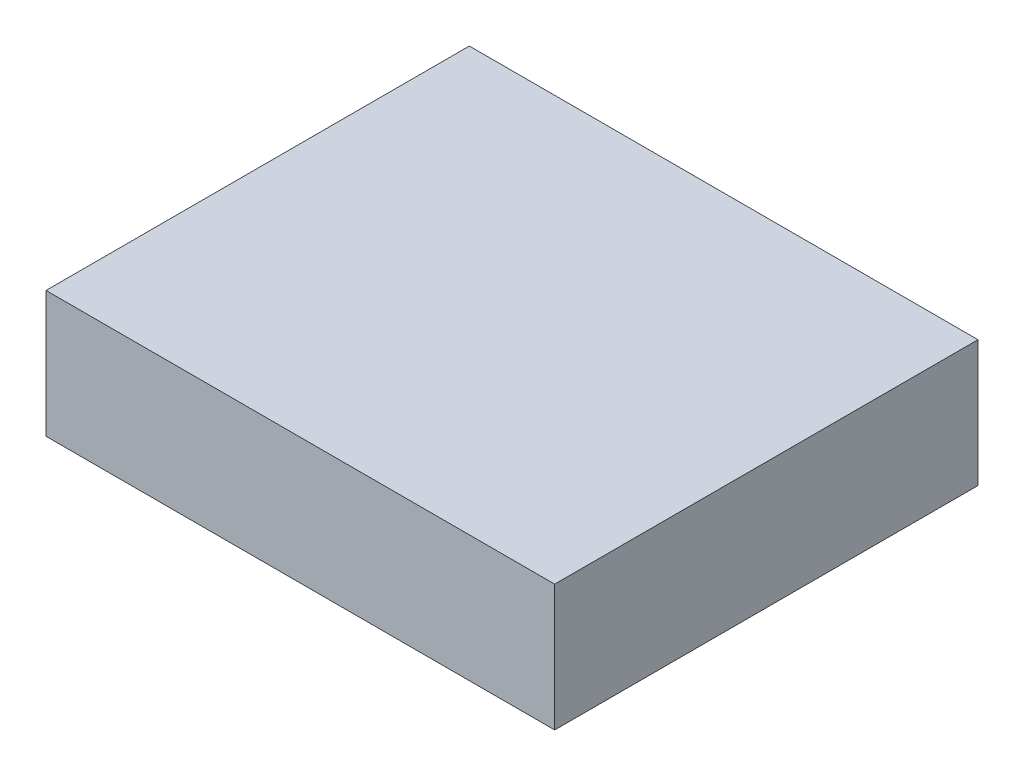
ISO-10303-21;
HEADER;
FILE_DESCRIPTION(('STEP AP214'),'2;1');
FILE_NAME('part.step','',(''),(''),'','','');
FILE_SCHEMA(('AUTOMOTIVE_DESIGN { 1 0 10303 214 1 1 1 1 }'));
ENDSEC;
DATA;
#1=APPLICATION_CONTEXT('core data for automotive mechanical design processes');
#2=APPLICATION_PROTOCOL_DEFINITION('international standard','automotive_design',2000,#1);
#3=PRODUCT_CONTEXT('',#1,'mechanical');
#4=PRODUCT('Part','Part','',(#3));
#5=PRODUCT_RELATED_PRODUCT_CATEGORY('part','',(#4));
#6=PRODUCT_DEFINITION_FORMATION('','',#4);
#7=PRODUCT_DEFINITION_CONTEXT('part definition',#1,'design');
#8=PRODUCT_DEFINITION('design','',#6,#7);
#9=PRODUCT_DEFINITION_SHAPE('','',#8);
#10=(LENGTH_UNIT() NAMED_UNIT(*) SI_UNIT(.MILLI.,.METRE.));
#11=(NAMED_UNIT(*) PLANE_ANGLE_UNIT() SI_UNIT($,.RADIAN.));
#12=(NAMED_UNIT(*) SI_UNIT($,.STERADIAN.) SOLID_ANGLE_UNIT());
#13=UNCERTAINTY_MEASURE_WITH_UNIT(LENGTH_MEASURE(1.E-05),#10,'distance_accuracy_value','');
#14=(GEOMETRIC_REPRESENTATION_CONTEXT(3) GLOBAL_UNCERTAINTY_ASSIGNED_CONTEXT((#13)) GLOBAL_UNIT_ASSIGNED_CONTEXT((#10,
#11,#12)) REPRESENTATION_CONTEXT('',''));
#15=CARTESIAN_POINT('',(0.,0.,0.));
#16=DIRECTION('',(0.,0.,1.));
#17=DIRECTION('',(1.,0.,0.));
#18=AXIS2_PLACEMENT_3D('',#15,#16,#17);
#19=CARTESIAN_POINT('',(0.,18.5,0.));
#20=DIRECTION('',(1.,0.,0.));
#21=DIRECTION('',(0.,0.,-1.));
#22=AXIS2_PLACEMENT_3D('',#19,#20,#21);
#23=PLANE('',#22);
#24=DIRECTION('',(0.,0.,1.));
#25=VECTOR('',#24,1.);
#26=CARTESIAN_POINT('',(0.,0.,0.));
#27=LINE('',#26,#25);
#28=CARTESIAN_POINT('',(0.,0.,0.));
#29=VERTEX_POINT('',#28);
#30=CARTESIAN_POINT('',(0.,0.,62.));
#31=VERTEX_POINT('',#30);
#32=EDGE_CURVE('E102',#29,#31,#27,.T.);
#33=ORIENTED_EDGE('',*,*,#32,.T.);
#34=DIRECTION('',(0.,-1.,0.));
#35=VECTOR('',#34,1.);
#36=CARTESIAN_POINT('',(0.,18.5,62.));
#37=LINE('',#36,#35);
#38=CARTESIAN_POINT('',(0.,18.5,62.));
#39=VERTEX_POINT('',#38);
#40=EDGE_CURVE('E11',#39,#31,#37,.T.);
#41=ORIENTED_EDGE('',*,*,#40,.F.);
#42=DIRECTION('',(0.,0.,1.));
#43=VECTOR('',#42,1.);
#44=CARTESIAN_POINT('',(0.,18.5,0.));
#45=LINE('',#44,#43);
#46=CARTESIAN_POINT('',(0.,18.5,0.));
#47=VERTEX_POINT('',#46);
#48=EDGE_CURVE('E95',#47,#39,#45,.T.);
#49=ORIENTED_EDGE('',*,*,#48,.F.);
#50=DIRECTION('',(0.,-1.,0.));
#51=VECTOR('',#50,1.);
#52=CARTESIAN_POINT('',(0.,18.5,0.));
#53=LINE('',#52,#51);
#54=EDGE_CURVE('E99',#47,#29,#53,.T.);
#55=ORIENTED_EDGE('',*,*,#54,.T.);
#56=EDGE_LOOP('',(#33,#41,#49,#55));
#57=FACE_BOUND('',#56,.T.);
#58=ADVANCED_FACE('F41',(#57),#23,.F.);
#59=CARTESIAN_POINT('',(0.,18.5,62.));
#60=DIRECTION('',(0.,0.,-1.));
#61=DIRECTION('',(-1.,0.,0.));
#62=AXIS2_PLACEMENT_3D('',#59,#60,#61);
#63=PLANE('',#62);
#64=DIRECTION('',(1.,0.,0.));
#65=VECTOR('',#64,1.);
#66=CARTESIAN_POINT('',(0.,0.,62.));
#67=LINE('',#66,#65);
#68=CARTESIAN_POINT('',(74.5,0.,62.));
#69=VERTEX_POINT('',#68);
#70=EDGE_CURVE('E96',#31,#69,#67,.T.);
#71=ORIENTED_EDGE('',*,*,#70,.T.);
#72=DIRECTION('',(0.,-1.,0.));
#73=VECTOR('',#72,1.);
#74=CARTESIAN_POINT('',(74.5,18.5,62.));
#75=LINE('',#74,#73);
#76=CARTESIAN_POINT('',(74.5,18.5,62.));
#77=VERTEX_POINT('',#76);
#78=EDGE_CURVE('E47',#77,#69,#75,.T.);
#79=ORIENTED_EDGE('',*,*,#78,.F.);
#80=DIRECTION('',(1.,0.,0.));
#81=VECTOR('',#80,1.);
#82=CARTESIAN_POINT('',(0.,18.5,62.));
#83=LINE('',#82,#81);
#84=EDGE_CURVE('E87',#39,#77,#83,.T.);
#85=ORIENTED_EDGE('',*,*,#84,.F.);
#86=ORIENTED_EDGE('',*,*,#40,.T.);
#87=EDGE_LOOP('',(#71,#79,#85,#86));
#88=FACE_BOUND('',#87,.T.);
#89=ADVANCED_FACE('F92',(#88),#63,.F.);
#90=CARTESIAN_POINT('',(74.5,18.5,0.));
#91=DIRECTION('',(-1.,0.,0.));
#92=DIRECTION('',(0.,0.,1.));
#93=AXIS2_PLACEMENT_3D('',#90,#91,#92);
#94=PLANE('',#93);
#95=DIRECTION('',(0.,0.,-1.));
#96=VECTOR('',#95,1.);
#97=CARTESIAN_POINT('',(74.5,0.,0.));
#98=LINE('',#97,#96);
#99=CARTESIAN_POINT('',(74.5,0.,0.));
#100=VERTEX_POINT('',#99);
#101=EDGE_CURVE('E74',#69,#100,#98,.T.);
#102=ORIENTED_EDGE('',*,*,#101,.T.);
#103=DIRECTION('',(0.,-1.,0.));
#104=VECTOR('',#103,1.);
#105=CARTESIAN_POINT('',(74.5,18.5,0.));
#106=LINE('',#105,#104);
#107=CARTESIAN_POINT('',(74.5,18.5,0.));
#108=VERTEX_POINT('',#107);
#109=EDGE_CURVE('E100',#108,#100,#106,.T.);
#110=ORIENTED_EDGE('',*,*,#109,.F.);
#111=DIRECTION('',(0.,0.,-1.));
#112=VECTOR('',#111,1.);
#113=CARTESIAN_POINT('',(74.5,18.5,0.));
#114=LINE('',#113,#112);
#115=EDGE_CURVE('E89',#77,#108,#114,.T.);
#116=ORIENTED_EDGE('',*,*,#115,.F.);
#117=ORIENTED_EDGE('',*,*,#78,.T.);
#118=EDGE_LOOP('',(#102,#110,#116,#117));
#119=FACE_BOUND('',#118,.T.);
#120=ADVANCED_FACE('F98',(#119),#94,.F.);
#121=CARTESIAN_POINT('',(0.,18.5,0.));
#122=DIRECTION('',(0.,0.,1.));
#123=DIRECTION('',(1.,0.,0.));
#124=AXIS2_PLACEMENT_3D('',#121,#122,#123);
#125=PLANE('',#124);
#126=DIRECTION('',(-1.,0.,0.));
#127=VECTOR('',#126,1.);
#128=CARTESIAN_POINT('',(0.,0.,0.));
#129=LINE('',#128,#127);
#130=EDGE_CURVE('E78',#100,#29,#129,.T.);
#131=ORIENTED_EDGE('',*,*,#130,.T.);
#132=ORIENTED_EDGE('',*,*,#54,.F.);
#133=DIRECTION('',(-1.,0.,0.));
#134=VECTOR('',#133,1.);
#135=CARTESIAN_POINT('',(0.,18.5,0.));
#136=LINE('',#135,#134);
#137=EDGE_CURVE('E60',#108,#47,#136,.T.);
#138=ORIENTED_EDGE('',*,*,#137,.F.);
#139=ORIENTED_EDGE('',*,*,#109,.T.);
#140=EDGE_LOOP('',(#131,#132,#138,#139));
#141=FACE_BOUND('',#140,.T.);
#142=ADVANCED_FACE('F112',(#141),#125,.F.);
#143=CARTESIAN_POINT('',(0.,18.5,0.));
#144=DIRECTION('',(0.,1.,0.));
#145=DIRECTION('',(0.,0.,1.));
#146=AXIS2_PLACEMENT_3D('',#143,#144,#145);
#147=PLANE('',#146);
#148=ORIENTED_EDGE('',*,*,#48,.T.);
#149=ORIENTED_EDGE('',*,*,#84,.T.);
#150=ORIENTED_EDGE('',*,*,#115,.T.);
#151=ORIENTED_EDGE('',*,*,#137,.T.);
#152=EDGE_LOOP('',(#148,#149,#150,#151));
#153=FACE_BOUND('',#152,.T.);
#154=ADVANCED_FACE('F86',(#153),#147,.T.);
#155=CARTESIAN_POINT('',(0.,0.,0.));
#156=DIRECTION('',(0.,1.,0.));
#157=DIRECTION('',(0.,0.,1.));
#158=AXIS2_PLACEMENT_3D('',#155,#156,#157);
#159=PLANE('',#158);
#160=ORIENTED_EDGE('',*,*,#32,.F.);
#161=ORIENTED_EDGE('',*,*,#130,.F.);
#162=ORIENTED_EDGE('',*,*,#101,.F.);
#163=ORIENTED_EDGE('',*,*,#70,.F.);
#164=EDGE_LOOP('',(#160,#161,#162,#163));
#165=FACE_BOUND('',#164,.T.);
#166=ADVANCED_FACE('F111',(#165),#159,.F.);
#167=CLOSED_SHELL('',(#58,#89,#120,#142,#154,#166));
#168=MANIFOLD_SOLID_BREP('B2',#167);
#169=ADVANCED_BREP_SHAPE_REPRESENTATION('',(#18,#168),#14);
#170=SHAPE_DEFINITION_REPRESENTATION(#9,#169);
ENDSEC;
END-ISO-10303-21;
